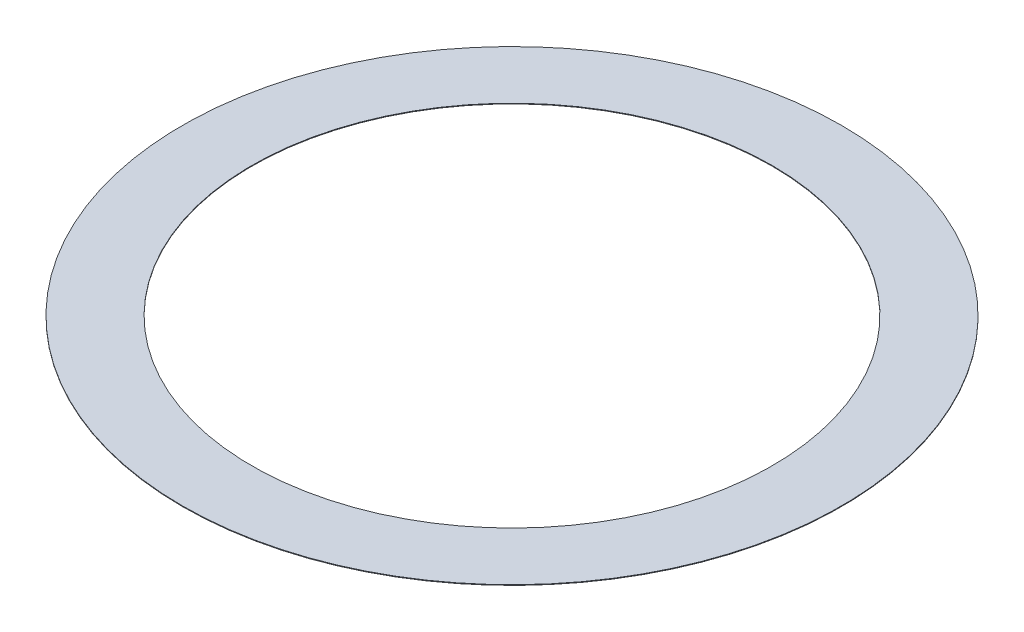
ISO-10303-21;
HEADER;
FILE_DESCRIPTION(('STEP AP214'),'2;1');
FILE_NAME('part.step','',(''),(''),'','','');
FILE_SCHEMA(('AUTOMOTIVE_DESIGN { 1 0 10303 214 1 1 1 1 }'));
ENDSEC;
DATA;
#1=APPLICATION_CONTEXT('core data for automotive mechanical design processes');
#2=APPLICATION_PROTOCOL_DEFINITION('international standard','automotive_design',2000,#1);
#3=PRODUCT_CONTEXT('',#1,'mechanical');
#4=PRODUCT('Part','Part','',(#3));
#5=PRODUCT_RELATED_PRODUCT_CATEGORY('part','',(#4));
#6=PRODUCT_DEFINITION_FORMATION('','',#4);
#7=PRODUCT_DEFINITION_CONTEXT('part definition',#1,'design');
#8=PRODUCT_DEFINITION('design','',#6,#7);
#9=PRODUCT_DEFINITION_SHAPE('','',#8);
#10=(LENGTH_UNIT() NAMED_UNIT(*) SI_UNIT(.MILLI.,.METRE.));
#11=(NAMED_UNIT(*) PLANE_ANGLE_UNIT() SI_UNIT($,.RADIAN.));
#12=(NAMED_UNIT(*) SI_UNIT($,.STERADIAN.) SOLID_ANGLE_UNIT());
#13=UNCERTAINTY_MEASURE_WITH_UNIT(LENGTH_MEASURE(1.E-05),#10,'distance_accuracy_value','');
#14=(GEOMETRIC_REPRESENTATION_CONTEXT(3) GLOBAL_UNCERTAINTY_ASSIGNED_CONTEXT((#13)) GLOBAL_UNIT_ASSIGNED_CONTEXT((#10,
#11,#12)) REPRESENTATION_CONTEXT('',''));
#15=CARTESIAN_POINT('',(0.,0.,0.));
#16=DIRECTION('',(0.,0.,1.));
#17=DIRECTION('',(1.,0.,0.));
#18=AXIS2_PLACEMENT_3D('',#15,#16,#17);
#19=CARTESIAN_POINT('',(0.,0.04,0.));
#20=DIRECTION('',(0.,1.,0.));
#21=DIRECTION('',(0.,0.,1.));
#22=AXIS2_PLACEMENT_3D('',#19,#20,#21);
#23=PLANE('',#22);
#24=CARTESIAN_POINT('',(0.,0.04,0.));
#25=DIRECTION('',(0.,1.,0.));
#26=DIRECTION('',(0.,0.,1.));
#27=AXIS2_PLACEMENT_3D('',#24,#25,#26);
#28=CIRCLE('',#27,20.9);
#29=CARTESIAN_POINT('',(0.,0.04,-20.9));
#30=VERTEX_POINT('',#29);
#31=EDGE_CURVE('E10',#30,#30,#28,.T.);
#32=ORIENTED_EDGE('',*,*,#31,.T.);
#33=EDGE_LOOP('',(#32));
#34=FACE_BOUND('',#33,.T.);
#35=CARTESIAN_POINT('',(0.,0.04,0.));
#36=DIRECTION('',(0.,1.,0.));
#37=DIRECTION('',(0.,0.,1.));
#38=AXIS2_PLACEMENT_3D('',#35,#36,#37);
#39=CIRCLE('',#38,16.5);
#40=CARTESIAN_POINT('',(0.,0.04,-16.5));
#41=VERTEX_POINT('',#40);
#42=EDGE_CURVE('E48',#41,#41,#39,.T.);
#43=ORIENTED_EDGE('',*,*,#42,.F.);
#44=EDGE_LOOP('',(#43));
#45=FACE_BOUND('',#44,.T.);
#46=ADVANCED_FACE('F40',(#34,#45),#23,.T.);
#47=CARTESIAN_POINT('',(0.,0.,0.));
#48=DIRECTION('',(0.,1.,0.));
#49=DIRECTION('',(0.,0.,1.));
#50=AXIS2_PLACEMENT_3D('',#47,#48,#49);
#51=PLANE('',#50);
#52=CARTESIAN_POINT('',(0.,0.,0.));
#53=DIRECTION('',(0.,1.,0.));
#54=DIRECTION('',(0.,0.,1.));
#55=AXIS2_PLACEMENT_3D('',#52,#53,#54);
#56=CIRCLE('',#55,20.9);
#57=CARTESIAN_POINT('',(0.,0.,-20.9));
#58=VERTEX_POINT('',#57);
#59=EDGE_CURVE('E41',#58,#58,#56,.T.);
#60=ORIENTED_EDGE('',*,*,#59,.F.);
#61=EDGE_LOOP('',(#60));
#62=FACE_BOUND('',#61,.T.);
#63=CARTESIAN_POINT('',(0.,0.,0.));
#64=DIRECTION('',(0.,1.,0.));
#65=DIRECTION('',(0.,0.,1.));
#66=AXIS2_PLACEMENT_3D('',#63,#64,#65);
#67=CIRCLE('',#66,16.5);
#68=CARTESIAN_POINT('',(0.,0.,-16.5));
#69=VERTEX_POINT('',#68);
#70=EDGE_CURVE('E49',#69,#69,#67,.T.);
#71=ORIENTED_EDGE('',*,*,#70,.T.);
#72=EDGE_LOOP('',(#71));
#73=FACE_BOUND('',#72,.T.);
#74=ADVANCED_FACE('F58',(#62,#73),#51,.F.);
#75=CARTESIAN_POINT('',(0.,0.04,0.));
#76=DIRECTION('',(0.,-1.,0.));
#77=DIRECTION('',(0.,0.,-1.));
#78=AXIS2_PLACEMENT_3D('',#75,#76,#77);
#79=CYLINDRICAL_SURFACE('',#78,20.9);
#80=CARTESIAN_POINT('',(0.,0.04,-20.9));
#81=CARTESIAN_POINT('',(0.,0.0395833333333333,-20.9));
#82=CARTESIAN_POINT('',(0.,0.0391666666666667,-20.9));
#83=CARTESIAN_POINT('',(0.,0.0383333333333333,-20.9));
#84=CARTESIAN_POINT('',(0.,0.0379166666666667,-20.9));
#85=CARTESIAN_POINT('',(0.,0.0370833333333333,-20.9));
#86=CARTESIAN_POINT('',(0.,0.0366666666666667,-20.9));
#87=CARTESIAN_POINT('',(0.,0.0358333333333333,-20.9));
#88=CARTESIAN_POINT('',(0.,0.0354166666666667,-20.9));
#89=CARTESIAN_POINT('',(0.,0.0345833333333333,-20.9));
#90=CARTESIAN_POINT('',(0.,0.0341666666666667,-20.9));
#91=CARTESIAN_POINT('',(0.,0.0333333333333333,-20.9));
#92=CARTESIAN_POINT('',(0.,0.0329166666666667,-20.9));
#93=CARTESIAN_POINT('',(0.,0.0320833333333333,-20.9));
#94=CARTESIAN_POINT('',(0.,0.0316666666666667,-20.9));
#95=CARTESIAN_POINT('',(0.,0.0308333333333333,-20.9));
#96=CARTESIAN_POINT('',(0.,0.0304166666666667,-20.9));
#97=CARTESIAN_POINT('',(0.,0.0295833333333333,-20.9));
#98=CARTESIAN_POINT('',(0.,0.0291666666666667,-20.9));
#99=CARTESIAN_POINT('',(0.,0.0283333333333333,-20.9));
#100=CARTESIAN_POINT('',(0.,0.0279166666666667,-20.9));
#101=CARTESIAN_POINT('',(0.,0.0270833333333333,-20.9));
#102=CARTESIAN_POINT('',(0.,0.0266666666666667,-20.9));
#103=CARTESIAN_POINT('',(0.,0.0258333333333333,-20.9));
#104=CARTESIAN_POINT('',(0.,0.0254166666666667,-20.9));
#105=CARTESIAN_POINT('',(0.,0.0245833333333333,-20.9));
#106=CARTESIAN_POINT('',(0.,0.0241666666666667,-20.9));
#107=CARTESIAN_POINT('',(0.,0.0233333333333333,-20.9));
#108=CARTESIAN_POINT('',(0.,0.0229166666666667,-20.9));
#109=CARTESIAN_POINT('',(0.,0.0220833333333333,-20.9));
#110=CARTESIAN_POINT('',(0.,0.0216666666666667,-20.9));
#111=CARTESIAN_POINT('',(0.,0.0208333333333333,-20.9));
#112=CARTESIAN_POINT('',(0.,0.0204166666666667,-20.9));
#113=CARTESIAN_POINT('',(0.,0.0195833333333333,-20.9));
#114=CARTESIAN_POINT('',(0.,0.0191666666666667,-20.9));
#115=CARTESIAN_POINT('',(0.,0.0183333333333333,-20.9));
#116=CARTESIAN_POINT('',(0.,0.0179166666666667,-20.9));
#117=CARTESIAN_POINT('',(0.,0.0170833333333333,-20.9));
#118=CARTESIAN_POINT('',(0.,0.0166666666666667,-20.9));
#119=CARTESIAN_POINT('',(0.,0.0158333333333333,-20.9));
#120=CARTESIAN_POINT('',(0.,0.0154166666666667,-20.9));
#121=CARTESIAN_POINT('',(0.,0.0145833333333333,-20.9));
#122=CARTESIAN_POINT('',(0.,0.0141666666666667,-20.9));
#123=CARTESIAN_POINT('',(0.,0.0133333333333333,-20.9));
#124=CARTESIAN_POINT('',(0.,0.0129166666666667,-20.9));
#125=CARTESIAN_POINT('',(0.,0.0120833333333333,-20.9));
#126=CARTESIAN_POINT('',(0.,0.0116666666666667,-20.9));
#127=CARTESIAN_POINT('',(0.,0.0108333333333333,-20.9));
#128=CARTESIAN_POINT('',(0.,0.0104166666666667,-20.9));
#129=CARTESIAN_POINT('',(0.,0.00958333333333333,-20.9));
#130=CARTESIAN_POINT('',(0.,0.00916666666666667,-20.9));
#131=CARTESIAN_POINT('',(0.,0.00833333333333333,-20.9));
#132=CARTESIAN_POINT('',(0.,0.00791666666666667,-20.9));
#133=CARTESIAN_POINT('',(0.,0.00708333333333333,-20.9));
#134=CARTESIAN_POINT('',(0.,0.00666666666666667,-20.9));
#135=CARTESIAN_POINT('',(0.,0.00583333333333333,-20.9));
#136=CARTESIAN_POINT('',(0.,0.00541666666666667,-20.9));
#137=CARTESIAN_POINT('',(0.,0.00458333333333333,-20.9));
#138=CARTESIAN_POINT('',(0.,0.00416666666666667,-20.9));
#139=CARTESIAN_POINT('',(0.,0.00333333333333334,-20.9));
#140=CARTESIAN_POINT('',(0.,0.00291666666666667,-20.9));
#141=CARTESIAN_POINT('',(0.,0.00208333333333333,-20.9));
#142=CARTESIAN_POINT('',(0.,0.00166666666666667,-20.9));
#143=CARTESIAN_POINT('',(0.,0.000833333333333335,-20.9));
#144=CARTESIAN_POINT('',(0.,0.000416666666666667,-20.9));
#145=CARTESIAN_POINT('',(0.,0.,-20.9));
#146=B_SPLINE_CURVE_WITH_KNOTS('',3,(#80,#81,#82,#83,#84,#85,#86,#87,#88,#89,#90,#91,#92,#93,
#94,#95,#96,#97,#98,#99,#100,#101,#102,#103,#104,#105,#106,#107,#108,#109,#110,#111,#112,#113,
#114,#115,#116,#117,#118,#119,#120,#121,#122,#123,#124,#125,#126,#127,#128,#129,#130,#131,#132,
#133,#134,#135,#136,#137,#138,#139,#140,#141,#142,#143,#144,#145),.UNSPECIFIED.,.F.,.F.,(4,2,2,
2,2,2,2,2,2,2,2,2,2,2,2,2,2,2,2,2,2,2,2,2,2,2,2,2,2,2,2,2,4),(0.,0.00125,0.00250000000000001,
0.00375,0.00500000000000001,0.00625,0.00750000000000001,0.00875,0.01,0.01125,0.0125,0.01375,
0.015,0.01625,0.0175,0.01875,0.02,0.02125,0.0225,0.02375,0.025,0.02625,0.0275,0.02875,0.03,
0.03125,0.0325,0.03375,0.035,0.03625,0.0375,0.03875,0.04),.UNSPECIFIED.);
#147=EDGE_CURVE('BSEAM39',#30,#58,#146,.T.);
#148=ORIENTED_EDGE('',*,*,#31,.F.);
#149=ORIENTED_EDGE('',*,*,#59,.T.);
#150=ORIENTED_EDGE('',*,*,#147,.T.);
#151=ORIENTED_EDGE('',*,*,#147,.F.);
#152=EDGE_LOOP('',(#148,#150,#149,#151));
#153=FACE_BOUND('',#152,.T.);
#154=ADVANCED_FACE('F39',(#153),#79,.T.);
#155=CARTESIAN_POINT('',(0.,0.04,0.));
#156=DIRECTION('',(0.,-1.,0.));
#157=DIRECTION('',(0.,0.,-1.));
#158=AXIS2_PLACEMENT_3D('',#155,#156,#157);
#159=CYLINDRICAL_SURFACE('',#158,16.5);
#160=CARTESIAN_POINT('',(0.,0.04,-16.5));
#161=CARTESIAN_POINT('',(0.,0.0395833333333333,-16.5));
#162=CARTESIAN_POINT('',(0.,0.0391666666666667,-16.5));
#163=CARTESIAN_POINT('',(0.,0.0383333333333333,-16.5));
#164=CARTESIAN_POINT('',(0.,0.0379166666666667,-16.5));
#165=CARTESIAN_POINT('',(0.,0.0370833333333333,-16.5));
#166=CARTESIAN_POINT('',(0.,0.0366666666666667,-16.5));
#167=CARTESIAN_POINT('',(0.,0.0358333333333333,-16.5));
#168=CARTESIAN_POINT('',(0.,0.0354166666666667,-16.5));
#169=CARTESIAN_POINT('',(0.,0.0345833333333333,-16.5));
#170=CARTESIAN_POINT('',(0.,0.0341666666666667,-16.5));
#171=CARTESIAN_POINT('',(0.,0.0333333333333333,-16.5));
#172=CARTESIAN_POINT('',(0.,0.0329166666666667,-16.5));
#173=CARTESIAN_POINT('',(0.,0.0320833333333333,-16.5));
#174=CARTESIAN_POINT('',(0.,0.0316666666666667,-16.5));
#175=CARTESIAN_POINT('',(0.,0.0308333333333333,-16.5));
#176=CARTESIAN_POINT('',(0.,0.0304166666666667,-16.5));
#177=CARTESIAN_POINT('',(0.,0.0295833333333333,-16.5));
#178=CARTESIAN_POINT('',(0.,0.0291666666666667,-16.5));
#179=CARTESIAN_POINT('',(0.,0.0283333333333333,-16.5));
#180=CARTESIAN_POINT('',(0.,0.0279166666666667,-16.5));
#181=CARTESIAN_POINT('',(0.,0.0270833333333333,-16.5));
#182=CARTESIAN_POINT('',(0.,0.0266666666666667,-16.5));
#183=CARTESIAN_POINT('',(0.,0.0258333333333333,-16.5));
#184=CARTESIAN_POINT('',(0.,0.0254166666666667,-16.5));
#185=CARTESIAN_POINT('',(0.,0.0245833333333333,-16.5));
#186=CARTESIAN_POINT('',(0.,0.0241666666666667,-16.5));
#187=CARTESIAN_POINT('',(0.,0.0233333333333333,-16.5));
#188=CARTESIAN_POINT('',(0.,0.0229166666666667,-16.5));
#189=CARTESIAN_POINT('',(0.,0.0220833333333333,-16.5));
#190=CARTESIAN_POINT('',(0.,0.0216666666666667,-16.5));
#191=CARTESIAN_POINT('',(0.,0.0208333333333333,-16.5));
#192=CARTESIAN_POINT('',(0.,0.0204166666666667,-16.5));
#193=CARTESIAN_POINT('',(0.,0.0195833333333333,-16.5));
#194=CARTESIAN_POINT('',(0.,0.0191666666666667,-16.5));
#195=CARTESIAN_POINT('',(0.,0.0183333333333333,-16.5));
#196=CARTESIAN_POINT('',(0.,0.0179166666666667,-16.5));
#197=CARTESIAN_POINT('',(0.,0.0170833333333333,-16.5));
#198=CARTESIAN_POINT('',(0.,0.0166666666666667,-16.5));
#199=CARTESIAN_POINT('',(0.,0.0158333333333333,-16.5));
#200=CARTESIAN_POINT('',(0.,0.0154166666666667,-16.5));
#201=CARTESIAN_POINT('',(0.,0.0145833333333333,-16.5));
#202=CARTESIAN_POINT('',(0.,0.0141666666666667,-16.5));
#203=CARTESIAN_POINT('',(0.,0.0133333333333333,-16.5));
#204=CARTESIAN_POINT('',(0.,0.0129166666666667,-16.5));
#205=CARTESIAN_POINT('',(0.,0.0120833333333333,-16.5));
#206=CARTESIAN_POINT('',(0.,0.0116666666666667,-16.5));
#207=CARTESIAN_POINT('',(0.,0.0108333333333333,-16.5));
#208=CARTESIAN_POINT('',(0.,0.0104166666666667,-16.5));
#209=CARTESIAN_POINT('',(0.,0.00958333333333333,-16.5));
#210=CARTESIAN_POINT('',(0.,0.00916666666666667,-16.5));
#211=CARTESIAN_POINT('',(0.,0.00833333333333333,-16.5));
#212=CARTESIAN_POINT('',(0.,0.00791666666666667,-16.5));
#213=CARTESIAN_POINT('',(0.,0.00708333333333333,-16.5));
#214=CARTESIAN_POINT('',(0.,0.00666666666666667,-16.5));
#215=CARTESIAN_POINT('',(0.,0.00583333333333333,-16.5));
#216=CARTESIAN_POINT('',(0.,0.00541666666666667,-16.5));
#217=CARTESIAN_POINT('',(0.,0.00458333333333333,-16.5));
#218=CARTESIAN_POINT('',(0.,0.00416666666666667,-16.5));
#219=CARTESIAN_POINT('',(0.,0.00333333333333334,-16.5));
#220=CARTESIAN_POINT('',(0.,0.00291666666666667,-16.5));
#221=CARTESIAN_POINT('',(0.,0.00208333333333333,-16.5));
#222=CARTESIAN_POINT('',(0.,0.00166666666666667,-16.5));
#223=CARTESIAN_POINT('',(0.,0.000833333333333335,-16.5));
#224=CARTESIAN_POINT('',(0.,0.000416666666666667,-16.5));
#225=CARTESIAN_POINT('',(0.,0.,-16.5));
#226=B_SPLINE_CURVE_WITH_KNOTS('',3,(#160,#161,#162,#163,#164,#165,#166,#167,#168,#169,#170,
#171,#172,#173,#174,#175,#176,#177,#178,#179,#180,#181,#182,#183,#184,#185,#186,#187,#188,#189,
#190,#191,#192,#193,#194,#195,#196,#197,#198,#199,#200,#201,#202,#203,#204,#205,#206,#207,#208,
#209,#210,#211,#212,#213,#214,#215,#216,#217,#218,#219,#220,#221,#222,#223,#224,#225),
.UNSPECIFIED.,.F.,.F.,(4,2,2,2,2,2,2,2,2,2,2,2,2,2,2,2,2,2,2,2,2,2,2,2,2,2,2,2,2,2,2,2,4),(0.,
0.00125,0.00249999999999999,0.00375,0.005,0.00625,0.0075,0.00875,0.01,0.01125,0.0125,0.01375,
0.015,0.01625,0.0175,0.01875,0.02,0.02125,0.0225,0.02375,0.025,0.02625,0.0275,0.02875,0.03,
0.03125,0.0325,0.03375,0.035,0.03625,0.0375,0.03875,0.04),.UNSPECIFIED.);
#227=EDGE_CURVE('BSEAM57',#41,#69,#226,.T.);
#228=ORIENTED_EDGE('',*,*,#42,.T.);
#229=ORIENTED_EDGE('',*,*,#70,.F.);
#230=ORIENTED_EDGE('',*,*,#227,.T.);
#231=ORIENTED_EDGE('',*,*,#227,.F.);
#232=EDGE_LOOP('',(#228,#230,#229,#231));
#233=FACE_BOUND('',#232,.T.);
#234=ADVANCED_FACE('F57',(#233),#159,.F.);
#235=CLOSED_SHELL('',(#46,#74,#154,#234));
#236=MANIFOLD_SOLID_BREP('B2',#235);
#237=ADVANCED_BREP_SHAPE_REPRESENTATION('',(#18,#236),#14);
#238=SHAPE_DEFINITION_REPRESENTATION(#9,#237);
ENDSEC;
END-ISO-10303-21;
